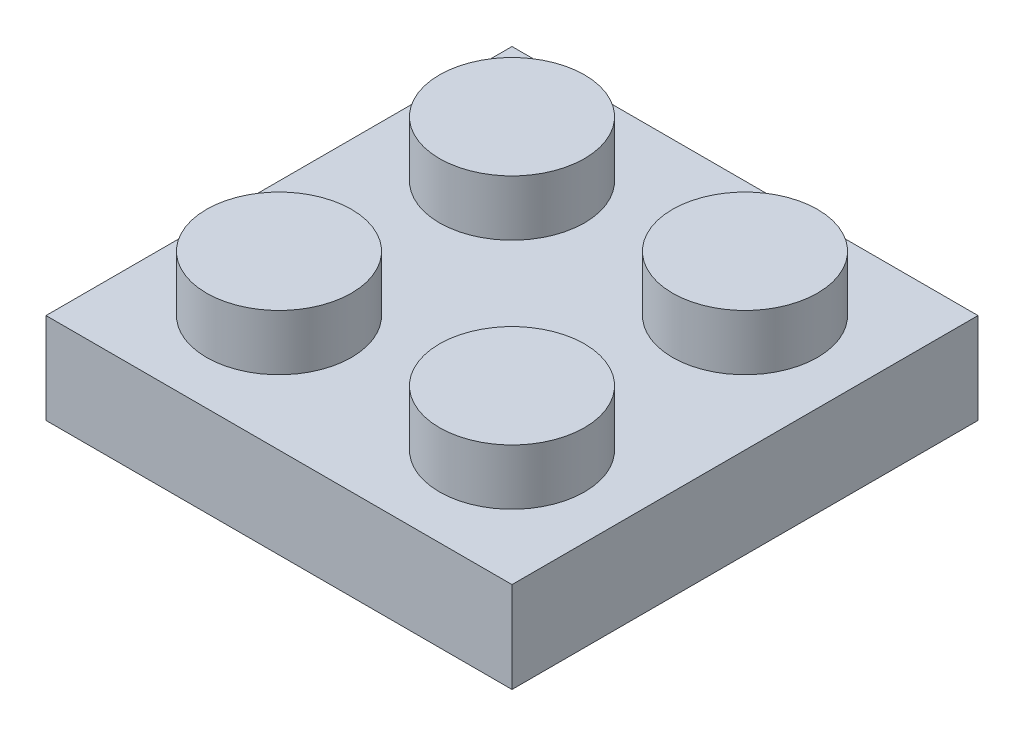
ISO-10303-21;
HEADER;
FILE_DESCRIPTION(('STEP AP214'),'2;1');
FILE_NAME('part.step','',(''),(''),'','','');
FILE_SCHEMA(('AUTOMOTIVE_DESIGN { 1 0 10303 214 1 1 1 1 }'));
ENDSEC;
DATA;
#1=APPLICATION_CONTEXT('core data for automotive mechanical design processes');
#2=APPLICATION_PROTOCOL_DEFINITION('international standard','automotive_design',2000,#1);
#3=PRODUCT_CONTEXT('',#1,'mechanical');
#4=PRODUCT('Part','Part','',(#3));
#5=PRODUCT_RELATED_PRODUCT_CATEGORY('part','',(#4));
#6=PRODUCT_DEFINITION_FORMATION('','',#4);
#7=PRODUCT_DEFINITION_CONTEXT('part definition',#1,'design');
#8=PRODUCT_DEFINITION('design','',#6,#7);
#9=PRODUCT_DEFINITION_SHAPE('','',#8);
#10=(LENGTH_UNIT() NAMED_UNIT(*) SI_UNIT(.MILLI.,.METRE.));
#11=(NAMED_UNIT(*) PLANE_ANGLE_UNIT() SI_UNIT($,.RADIAN.));
#12=(NAMED_UNIT(*) SI_UNIT($,.STERADIAN.) SOLID_ANGLE_UNIT());
#13=UNCERTAINTY_MEASURE_WITH_UNIT(LENGTH_MEASURE(1.E-05),#10,'distance_accuracy_value','');
#14=(GEOMETRIC_REPRESENTATION_CONTEXT(3) GLOBAL_UNCERTAINTY_ASSIGNED_CONTEXT((#13)) GLOBAL_UNIT_ASSIGNED_CONTEXT((#10,
#11,#12)) REPRESENTATION_CONTEXT('',''));
#15=CARTESIAN_POINT('',(0.,0.,0.));
#16=DIRECTION('',(0.,0.,1.));
#17=DIRECTION('',(1.,0.,0.));
#18=AXIS2_PLACEMENT_3D('',#15,#16,#17);
#19=CARTESIAN_POINT('',(-43.7441666397823,3.1,33.8664515920896));
#20=DIRECTION('',(0.,1.,0.));
#21=DIRECTION('',(0.,0.,1.));
#22=AXIS2_PLACEMENT_3D('',#19,#20,#21);
#23=PLANE('',#22);
#24=CARTESIAN_POINT('',(-39.7691666397823,3.1,45.7914515920896));
#25=DIRECTION('',(0.,1.,0.));
#26=DIRECTION('',(0.,0.,1.));
#27=AXIS2_PLACEMENT_3D('',#24,#25,#26);
#28=CIRCLE('',#27,2.475);
#29=CARTESIAN_POINT('',(-39.7691666397823,3.1,43.3164515920896));
#30=VERTEX_POINT('',#29);
#31=EDGE_CURVE('E247',#30,#30,#28,.T.);
#32=ORIENTED_EDGE('',*,*,#31,.F.);
#33=EDGE_LOOP('',(#32));
#34=FACE_BOUND('',#33,.T.);
#35=CARTESIAN_POINT('',(-39.7691666397823,3.1,37.8414515920896));
#36=DIRECTION('',(0.,1.,0.));
#37=DIRECTION('',(0.,0.,1.));
#38=AXIS2_PLACEMENT_3D('',#35,#36,#37);
#39=CIRCLE('',#38,2.475);
#40=CARTESIAN_POINT('',(-39.7691666397823,3.1,35.3664515920896));
#41=VERTEX_POINT('',#40);
#42=EDGE_CURVE('E132',#41,#41,#39,.T.);
#43=ORIENTED_EDGE('',*,*,#42,.F.);
#44=EDGE_LOOP('',(#43));
#45=FACE_BOUND('',#44,.T.);
#46=DIRECTION('',(-1.,0.,0.));
#47=VECTOR('',#46,1.);
#48=CARTESIAN_POINT('',(-27.8441666397823,3.1,33.8664515920896));
#49=LINE('',#48,#47);
#50=CARTESIAN_POINT('',(-27.8441666397823,3.1,33.8664515920896));
#51=VERTEX_POINT('',#50);
#52=CARTESIAN_POINT('',(-43.7441666397823,3.1,33.8664515920896));
#53=VERTEX_POINT('',#52);
#54=EDGE_CURVE('E149',#51,#53,#49,.T.);
#55=ORIENTED_EDGE('',*,*,#54,.T.);
#56=DIRECTION('',(0.,0.,1.));
#57=VECTOR('',#56,1.);
#58=CARTESIAN_POINT('',(-43.7441666397823,3.1,33.8664515920896));
#59=LINE('',#58,#57);
#60=CARTESIAN_POINT('',(-43.7441666397823,3.1,49.7664515920896));
#61=VERTEX_POINT('',#60);
#62=EDGE_CURVE('E84',#53,#61,#59,.T.);
#63=ORIENTED_EDGE('',*,*,#62,.T.);
#64=DIRECTION('',(1.,0.,0.));
#65=VECTOR('',#64,1.);
#66=CARTESIAN_POINT('',(-43.7441666397823,3.1,49.7664515920896));
#67=LINE('',#66,#65);
#68=CARTESIAN_POINT('',(-27.8441666397823,3.1,49.7664515920896));
#69=VERTEX_POINT('',#68);
#70=EDGE_CURVE('E152',#61,#69,#67,.T.);
#71=ORIENTED_EDGE('',*,*,#70,.T.);
#72=DIRECTION('',(0.,0.,-1.));
#73=VECTOR('',#72,1.);
#74=CARTESIAN_POINT('',(-27.8441666397823,3.1,49.7664515920896));
#75=LINE('',#74,#73);
#76=EDGE_CURVE('E56',#69,#51,#75,.T.);
#77=ORIENTED_EDGE('',*,*,#76,.T.);
#78=EDGE_LOOP('',(#55,#63,#71,#77));
#79=FACE_BOUND('',#78,.T.);
#80=CARTESIAN_POINT('',(-31.8191666397823,3.1,37.8414515920896));
#81=DIRECTION('',(0.,1.,0.));
#82=DIRECTION('',(0.,0.,1.));
#83=AXIS2_PLACEMENT_3D('',#80,#81,#82);
#84=CIRCLE('',#83,2.475);
#85=CARTESIAN_POINT('',(-31.8191666397823,3.1,35.3664515920896));
#86=VERTEX_POINT('',#85);
#87=EDGE_CURVE('E257',#86,#86,#84,.T.);
#88=ORIENTED_EDGE('',*,*,#87,.F.);
#89=EDGE_LOOP('',(#88));
#90=FACE_BOUND('',#89,.T.);
#91=CARTESIAN_POINT('',(-31.8191666397823,3.1,45.7914515920896));
#92=DIRECTION('',(0.,1.,0.));
#93=DIRECTION('',(0.,0.,1.));
#94=AXIS2_PLACEMENT_3D('',#91,#92,#93);
#95=CIRCLE('',#94,2.475);
#96=CARTESIAN_POINT('',(-31.8191666397823,3.1,43.3164515920896));
#97=VERTEX_POINT('',#96);
#98=EDGE_CURVE('E248',#97,#97,#95,.T.);
#99=ORIENTED_EDGE('',*,*,#98,.F.);
#100=EDGE_LOOP('',(#99));
#101=FACE_BOUND('',#100,.T.);
#102=ADVANCED_FACE('F32',(#34,#45,#79,#90,#101),#23,.T.);
#103=CARTESIAN_POINT('',(-27.8441666397823,3.1,33.8664515920896));
#104=DIRECTION('',(0.,0.,1.));
#105=DIRECTION('',(1.,0.,0.));
#106=AXIS2_PLACEMENT_3D('',#103,#104,#105);
#107=PLANE('',#106);
#108=DIRECTION('',(-1.,0.,0.));
#109=VECTOR('',#108,1.);
#110=CARTESIAN_POINT('',(-27.8441666397823,0.,33.8664515920896));
#111=LINE('',#110,#109);
#112=CARTESIAN_POINT('',(-27.8441666397823,0.,33.8664515920896));
#113=VERTEX_POINT('',#112);
#114=CARTESIAN_POINT('',(-43.7441666397823,0.,33.8664515920896));
#115=VERTEX_POINT('',#114);
#116=EDGE_CURVE('E145',#113,#115,#111,.T.);
#117=ORIENTED_EDGE('',*,*,#116,.T.);
#118=DIRECTION('',(0.,-1.,0.));
#119=VECTOR('',#118,1.);
#120=CARTESIAN_POINT('',(-43.7441666397823,3.1,33.8664515920896));
#121=LINE('',#120,#119);
#122=EDGE_CURVE('E11',#53,#115,#121,.T.);
#123=ORIENTED_EDGE('',*,*,#122,.F.);
#124=ORIENTED_EDGE('',*,*,#54,.F.);
#125=DIRECTION('',(0.,-1.,0.));
#126=VECTOR('',#125,1.);
#127=CARTESIAN_POINT('',(-27.8441666397823,3.1,33.8664515920896));
#128=LINE('',#127,#126);
#129=EDGE_CURVE('E155',#51,#113,#128,.T.);
#130=ORIENTED_EDGE('',*,*,#129,.T.);
#131=EDGE_LOOP('',(#117,#123,#124,#130));
#132=FACE_BOUND('',#131,.T.);
#133=ADVANCED_FACE('F34',(#132),#107,.F.);
#134=CARTESIAN_POINT('',(-43.7441666397823,3.1,33.8664515920896));
#135=DIRECTION('',(1.,0.,0.));
#136=DIRECTION('',(0.,0.,-1.));
#137=AXIS2_PLACEMENT_3D('',#134,#135,#136);
#138=PLANE('',#137);
#139=DIRECTION('',(0.,0.,1.));
#140=VECTOR('',#139,1.);
#141=CARTESIAN_POINT('',(-43.7441666397823,0.,33.8664515920896));
#142=LINE('',#141,#140);
#143=CARTESIAN_POINT('',(-43.7441666397823,0.,49.7664515920896));
#144=VERTEX_POINT('',#143);
#145=EDGE_CURVE('E158',#115,#144,#142,.T.);
#146=ORIENTED_EDGE('',*,*,#145,.T.);
#147=DIRECTION('',(0.,-1.,0.));
#148=VECTOR('',#147,1.);
#149=CARTESIAN_POINT('',(-43.7441666397823,3.1,49.7664515920896));
#150=LINE('',#149,#148);
#151=EDGE_CURVE('E40',#61,#144,#150,.T.);
#152=ORIENTED_EDGE('',*,*,#151,.F.);
#153=ORIENTED_EDGE('',*,*,#62,.F.);
#154=ORIENTED_EDGE('',*,*,#122,.T.);
#155=EDGE_LOOP('',(#146,#152,#153,#154));
#156=FACE_BOUND('',#155,.T.);
#157=ADVANCED_FACE('F186',(#156),#138,.F.);
#158=CARTESIAN_POINT('',(-43.7441666397823,3.1,49.7664515920896));
#159=DIRECTION('',(0.,0.,-1.));
#160=DIRECTION('',(-1.,0.,0.));
#161=AXIS2_PLACEMENT_3D('',#158,#159,#160);
#162=PLANE('',#161);
#163=DIRECTION('',(1.,0.,0.));
#164=VECTOR('',#163,1.);
#165=CARTESIAN_POINT('',(-43.7441666397823,0.,49.7664515920896));
#166=LINE('',#165,#164);
#167=CARTESIAN_POINT('',(-27.8441666397823,0.,49.7664515920896));
#168=VERTEX_POINT('',#167);
#169=EDGE_CURVE('E160',#144,#168,#166,.T.);
#170=ORIENTED_EDGE('',*,*,#169,.T.);
#171=DIRECTION('',(0.,-1.,0.));
#172=VECTOR('',#171,1.);
#173=CARTESIAN_POINT('',(-27.8441666397823,3.1,49.7664515920896));
#174=LINE('',#173,#172);
#175=EDGE_CURVE('E164',#69,#168,#174,.T.);
#176=ORIENTED_EDGE('',*,*,#175,.F.);
#177=ORIENTED_EDGE('',*,*,#70,.F.);
#178=ORIENTED_EDGE('',*,*,#151,.T.);
#179=EDGE_LOOP('',(#170,#176,#177,#178));
#180=FACE_BOUND('',#179,.T.);
#181=ADVANCED_FACE('F169',(#180),#162,.F.);
#182=CARTESIAN_POINT('',(-27.8441666397823,3.1,49.7664515920896));
#183=DIRECTION('',(-1.,0.,0.));
#184=DIRECTION('',(0.,0.,1.));
#185=AXIS2_PLACEMENT_3D('',#182,#183,#184);
#186=PLANE('',#185);
#187=DIRECTION('',(0.,0.,-1.));
#188=VECTOR('',#187,1.);
#189=CARTESIAN_POINT('',(-27.8441666397823,0.,49.7664515920896));
#190=LINE('',#189,#188);
#191=EDGE_CURVE('E77',#168,#113,#190,.T.);
#192=ORIENTED_EDGE('',*,*,#191,.T.);
#193=ORIENTED_EDGE('',*,*,#129,.F.);
#194=ORIENTED_EDGE('',*,*,#76,.F.);
#195=ORIENTED_EDGE('',*,*,#175,.T.);
#196=EDGE_LOOP('',(#192,#193,#194,#195));
#197=FACE_BOUND('',#196,.T.);
#198=ADVANCED_FACE('F177',(#197),#186,.F.);
#199=CARTESIAN_POINT('',(-43.7441666397823,0.,33.8664515920896));
#200=DIRECTION('',(0.,1.,0.));
#201=DIRECTION('',(0.,0.,1.));
#202=AXIS2_PLACEMENT_3D('',#199,#200,#201);
#203=PLANE('',#202);
#204=DIRECTION('',(1.,0.,0.));
#205=VECTOR('',#204,1.);
#206=CARTESIAN_POINT('',(-29.3441666397823,0.,35.3664515920896));
#207=LINE('',#206,#205);
#208=CARTESIAN_POINT('',(-42.2441666397823,0.,35.3664515920896));
#209=VERTEX_POINT('',#208);
#210=CARTESIAN_POINT('',(-29.3441666397823,0.,35.3664515920896));
#211=VERTEX_POINT('',#210);
#212=EDGE_CURVE('E138',#209,#211,#207,.T.);
#213=ORIENTED_EDGE('',*,*,#212,.F.);
#214=DIRECTION('',(0.,0.,-1.));
#215=VECTOR('',#214,1.);
#216=CARTESIAN_POINT('',(-42.2441666397823,0.,35.3664515920896));
#217=LINE('',#216,#215);
#218=CARTESIAN_POINT('',(-42.2441666397823,0.,48.2664515920896));
#219=VERTEX_POINT('',#218);
#220=EDGE_CURVE('E47',#219,#209,#217,.T.);
#221=ORIENTED_EDGE('',*,*,#220,.F.);
#222=DIRECTION('',(-1.,0.,0.));
#223=VECTOR('',#222,1.);
#224=CARTESIAN_POINT('',(-42.2441666397823,0.,48.2664515920896));
#225=LINE('',#224,#223);
#226=CARTESIAN_POINT('',(-29.3441666397823,0.,48.2664515920896));
#227=VERTEX_POINT('',#226);
#228=EDGE_CURVE('E126',#227,#219,#225,.T.);
#229=ORIENTED_EDGE('',*,*,#228,.F.);
#230=DIRECTION('',(0.,0.,1.));
#231=VECTOR('',#230,1.);
#232=CARTESIAN_POINT('',(-29.3441666397823,0.,48.2664515920896));
#233=LINE('',#232,#231);
#234=EDGE_CURVE('E129',#211,#227,#233,.T.);
#235=ORIENTED_EDGE('',*,*,#234,.F.);
#236=EDGE_LOOP('',(#213,#221,#229,#235));
#237=FACE_BOUND('',#236,.T.);
#238=ORIENTED_EDGE('',*,*,#116,.F.);
#239=ORIENTED_EDGE('',*,*,#191,.F.);
#240=ORIENTED_EDGE('',*,*,#169,.F.);
#241=ORIENTED_EDGE('',*,*,#145,.F.);
#242=EDGE_LOOP('',(#238,#239,#240,#241));
#243=FACE_BOUND('',#242,.T.);
#244=ADVANCED_FACE('F173',(#237,#243),#203,.F.);
#245=CARTESIAN_POINT('',(-42.2441666397823,1.9,35.3664515920896));
#246=DIRECTION('',(-1.,0.,0.));
#247=DIRECTION('',(0.,0.,1.));
#248=AXIS2_PLACEMENT_3D('',#245,#246,#247);
#249=PLANE('',#248);
#250=ORIENTED_EDGE('',*,*,#220,.T.);
#251=DIRECTION('',(0.,-1.,0.));
#252=VECTOR('',#251,1.);
#253=CARTESIAN_POINT('',(-42.2441666397823,1.9,35.3664515920896));
#254=LINE('',#253,#252);
#255=CARTESIAN_POINT('',(-42.2441666397823,1.9,35.3664515920896));
#256=VERTEX_POINT('',#255);
#257=EDGE_CURVE('E104',#256,#209,#254,.T.);
#258=ORIENTED_EDGE('',*,*,#257,.F.);
#259=DIRECTION('',(0.,0.,-1.));
#260=VECTOR('',#259,1.);
#261=CARTESIAN_POINT('',(-42.2441666397823,1.9,35.3664515920896));
#262=LINE('',#261,#260);
#263=CARTESIAN_POINT('',(-42.2441666397823,1.9,48.2664515920896));
#264=VERTEX_POINT('',#263);
#265=EDGE_CURVE('E108',#264,#256,#262,.T.);
#266=ORIENTED_EDGE('',*,*,#265,.F.);
#267=DIRECTION('',(0.,-1.,0.));
#268=VECTOR('',#267,1.);
#269=CARTESIAN_POINT('',(-42.2441666397823,1.9,48.2664515920896));
#270=LINE('',#269,#268);
#271=EDGE_CURVE('E143',#264,#219,#270,.T.);
#272=ORIENTED_EDGE('',*,*,#271,.T.);
#273=EDGE_LOOP('',(#250,#258,#266,#272));
#274=FACE_BOUND('',#273,.T.);
#275=ADVANCED_FACE('F106',(#274),#249,.F.);
#276=CARTESIAN_POINT('',(-42.2441666397823,1.9,48.2664515920896));
#277=DIRECTION('',(0.,0.,1.));
#278=DIRECTION('',(1.,0.,0.));
#279=AXIS2_PLACEMENT_3D('',#276,#277,#278);
#280=PLANE('',#279);
#281=ORIENTED_EDGE('',*,*,#228,.T.);
#282=ORIENTED_EDGE('',*,*,#271,.F.);
#283=DIRECTION('',(-1.,0.,0.));
#284=VECTOR('',#283,1.);
#285=CARTESIAN_POINT('',(-42.2441666397823,1.9,48.2664515920896));
#286=LINE('',#285,#284);
#287=CARTESIAN_POINT('',(-29.3441666397823,1.9,48.2664515920896));
#288=VERTEX_POINT('',#287);
#289=EDGE_CURVE('E114',#288,#264,#286,.T.);
#290=ORIENTED_EDGE('',*,*,#289,.F.);
#291=DIRECTION('',(0.,-1.,0.));
#292=VECTOR('',#291,1.);
#293=CARTESIAN_POINT('',(-29.3441666397823,1.9,48.2664515920896));
#294=LINE('',#293,#292);
#295=EDGE_CURVE('E146',#288,#227,#294,.T.);
#296=ORIENTED_EDGE('',*,*,#295,.T.);
#297=EDGE_LOOP('',(#281,#282,#290,#296));
#298=FACE_BOUND('',#297,.T.);
#299=ADVANCED_FACE('F199',(#298),#280,.F.);
#300=CARTESIAN_POINT('',(-29.3441666397823,1.9,48.2664515920896));
#301=DIRECTION('',(1.,0.,0.));
#302=DIRECTION('',(0.,0.,-1.));
#303=AXIS2_PLACEMENT_3D('',#300,#301,#302);
#304=PLANE('',#303);
#305=ORIENTED_EDGE('',*,*,#234,.T.);
#306=ORIENTED_EDGE('',*,*,#295,.F.);
#307=DIRECTION('',(0.,0.,1.));
#308=VECTOR('',#307,1.);
#309=CARTESIAN_POINT('',(-29.3441666397823,1.9,48.2664515920896));
#310=LINE('',#309,#308);
#311=CARTESIAN_POINT('',(-29.3441666397823,1.9,35.3664515920896));
#312=VERTEX_POINT('',#311);
#313=EDGE_CURVE('E122',#312,#288,#310,.T.);
#314=ORIENTED_EDGE('',*,*,#313,.F.);
#315=DIRECTION('',(0.,-1.,0.));
#316=VECTOR('',#315,1.);
#317=CARTESIAN_POINT('',(-29.3441666397823,1.9,35.3664515920896));
#318=LINE('',#317,#316);
#319=EDGE_CURVE('E113',#312,#211,#318,.T.);
#320=ORIENTED_EDGE('',*,*,#319,.T.);
#321=EDGE_LOOP('',(#305,#306,#314,#320));
#322=FACE_BOUND('',#321,.T.);
#323=ADVANCED_FACE('F202',(#322),#304,.F.);
#324=CARTESIAN_POINT('',(-29.3441666397823,1.9,35.3664515920896));
#325=DIRECTION('',(0.,0.,-1.));
#326=DIRECTION('',(-1.,0.,0.));
#327=AXIS2_PLACEMENT_3D('',#324,#325,#326);
#328=PLANE('',#327);
#329=ORIENTED_EDGE('',*,*,#212,.T.);
#330=ORIENTED_EDGE('',*,*,#319,.F.);
#331=DIRECTION('',(1.,0.,0.));
#332=VECTOR('',#331,1.);
#333=CARTESIAN_POINT('',(-29.3441666397823,1.9,35.3664515920896));
#334=LINE('',#333,#332);
#335=EDGE_CURVE('E117',#256,#312,#334,.T.);
#336=ORIENTED_EDGE('',*,*,#335,.F.);
#337=ORIENTED_EDGE('',*,*,#257,.T.);
#338=EDGE_LOOP('',(#329,#330,#336,#337));
#339=FACE_BOUND('',#338,.T.);
#340=ADVANCED_FACE('F118',(#339),#328,.F.);
#341=CARTESIAN_POINT('',(-42.2441666397823,1.9,48.2664515920896));
#342=DIRECTION('',(0.,1.,0.));
#343=DIRECTION('',(0.,0.,1.));
#344=AXIS2_PLACEMENT_3D('',#341,#342,#343);
#345=PLANE('',#344);
#346=ORIENTED_EDGE('',*,*,#265,.T.);
#347=ORIENTED_EDGE('',*,*,#335,.T.);
#348=ORIENTED_EDGE('',*,*,#313,.T.);
#349=ORIENTED_EDGE('',*,*,#289,.T.);
#350=EDGE_LOOP('',(#346,#347,#348,#349));
#351=FACE_BOUND('',#350,.T.);
#352=ADVANCED_FACE('F124',(#351),#345,.F.);
#353=CARTESIAN_POINT('',(-39.7691666397823,5.,37.8414515920896));
#354=DIRECTION('',(0.,-1.,0.));
#355=DIRECTION('',(0.,0.,-1.));
#356=AXIS2_PLACEMENT_3D('',#353,#354,#355);
#357=CYLINDRICAL_SURFACE('',#356,2.475);
#358=CARTESIAN_POINT('',(-39.7691666397823,5.,37.8414515920896));
#359=DIRECTION('',(0.,1.,0.));
#360=DIRECTION('',(0.,0.,1.));
#361=AXIS2_PLACEMENT_3D('',#358,#359,#360);
#362=CIRCLE('',#361,2.475);
#363=CARTESIAN_POINT('',(-39.7691666397823,5.,35.3664515920896));
#364=VERTEX_POINT('',#363);
#365=EDGE_CURVE('E139',#364,#364,#362,.T.);
#366=CARTESIAN_POINT('',(-39.7691666397823,5.,35.3664515920896));
#367=CARTESIAN_POINT('',(-39.7691666397823,4.98020833333333,35.3664515920896));
#368=CARTESIAN_POINT('',(-39.7691666397823,4.96041666666667,35.3664515920896));
#369=CARTESIAN_POINT('',(-39.7691666397823,4.92083333333333,35.3664515920896));
#370=CARTESIAN_POINT('',(-39.7691666397823,4.90104166666667,35.3664515920896));
#371=CARTESIAN_POINT('',(-39.7691666397823,4.86145833333333,35.3664515920896));
#372=CARTESIAN_POINT('',(-39.7691666397823,4.84166666666667,35.3664515920896));
#373=CARTESIAN_POINT('',(-39.7691666397823,4.80208333333333,35.3664515920896));
#374=CARTESIAN_POINT('',(-39.7691666397823,4.78229166666667,35.3664515920896));
#375=CARTESIAN_POINT('',(-39.7691666397823,4.74270833333333,35.3664515920896));
#376=CARTESIAN_POINT('',(-39.7691666397823,4.72291666666667,35.3664515920896));
#377=CARTESIAN_POINT('',(-39.7691666397823,4.68333333333333,35.3664515920896));
#378=CARTESIAN_POINT('',(-39.7691666397823,4.66354166666667,35.3664515920896));
#379=CARTESIAN_POINT('',(-39.7691666397823,4.62395833333333,35.3664515920896));
#380=CARTESIAN_POINT('',(-39.7691666397823,4.60416666666667,35.3664515920896));
#381=CARTESIAN_POINT('',(-39.7691666397823,4.56458333333333,35.3664515920896));
#382=CARTESIAN_POINT('',(-39.7691666397823,4.54479166666667,35.3664515920896));
#383=CARTESIAN_POINT('',(-39.7691666397823,4.50520833333333,35.3664515920896));
#384=CARTESIAN_POINT('',(-39.7691666397823,4.48541666666667,35.3664515920896));
#385=CARTESIAN_POINT('',(-39.7691666397823,4.44583333333333,35.3664515920896));
#386=CARTESIAN_POINT('',(-39.7691666397823,4.42604166666667,35.3664515920896));
#387=CARTESIAN_POINT('',(-39.7691666397823,4.38645833333333,35.3664515920896));
#388=CARTESIAN_POINT('',(-39.7691666397823,4.36666666666667,35.3664515920896));
#389=CARTESIAN_POINT('',(-39.7691666397823,4.32708333333333,35.3664515920896));
#390=CARTESIAN_POINT('',(-39.7691666397823,4.30729166666667,35.3664515920896));
#391=CARTESIAN_POINT('',(-39.7691666397823,4.26770833333333,35.3664515920896));
#392=CARTESIAN_POINT('',(-39.7691666397823,4.24791666666667,35.3664515920896));
#393=CARTESIAN_POINT('',(-39.7691666397823,4.20833333333333,35.3664515920896));
#394=CARTESIAN_POINT('',(-39.7691666397823,4.18854166666667,35.3664515920896));
#395=CARTESIAN_POINT('',(-39.7691666397823,4.14895833333333,35.3664515920896));
#396=CARTESIAN_POINT('',(-39.7691666397823,4.12916666666667,35.3664515920896));
#397=CARTESIAN_POINT('',(-39.7691666397823,4.08958333333333,35.3664515920896));
#398=CARTESIAN_POINT('',(-39.7691666397823,4.06979166666667,35.3664515920896));
#399=CARTESIAN_POINT('',(-39.7691666397823,4.03020833333333,35.3664515920896));
#400=CARTESIAN_POINT('',(-39.7691666397823,4.01041666666667,35.3664515920896));
#401=CARTESIAN_POINT('',(-39.7691666397823,3.97083333333333,35.3664515920896));
#402=CARTESIAN_POINT('',(-39.7691666397823,3.95104166666667,35.3664515920896));
#403=CARTESIAN_POINT('',(-39.7691666397823,3.91145833333333,35.3664515920896));
#404=CARTESIAN_POINT('',(-39.7691666397823,3.89166666666667,35.3664515920896));
#405=CARTESIAN_POINT('',(-39.7691666397823,3.85208333333333,35.3664515920896));
#406=CARTESIAN_POINT('',(-39.7691666397823,3.83229166666667,35.3664515920896));
#407=CARTESIAN_POINT('',(-39.7691666397823,3.79270833333333,35.3664515920896));
#408=CARTESIAN_POINT('',(-39.7691666397823,3.77291666666667,35.3664515920896));
#409=CARTESIAN_POINT('',(-39.7691666397823,3.73333333333333,35.3664515920896));
#410=CARTESIAN_POINT('',(-39.7691666397823,3.71354166666667,35.3664515920896));
#411=CARTESIAN_POINT('',(-39.7691666397823,3.67395833333333,35.3664515920896));
#412=CARTESIAN_POINT('',(-39.7691666397823,3.65416666666667,35.3664515920896));
#413=CARTESIAN_POINT('',(-39.7691666397823,3.61458333333333,35.3664515920896));
#414=CARTESIAN_POINT('',(-39.7691666397823,3.59479166666667,35.3664515920896));
#415=CARTESIAN_POINT('',(-39.7691666397823,3.55520833333333,35.3664515920896));
#416=CARTESIAN_POINT('',(-39.7691666397823,3.53541666666667,35.3664515920896));
#417=CARTESIAN_POINT('',(-39.7691666397823,3.49583333333333,35.3664515920896));
#418=CARTESIAN_POINT('',(-39.7691666397823,3.47604166666667,35.3664515920896));
#419=CARTESIAN_POINT('',(-39.7691666397823,3.43645833333333,35.3664515920896));
#420=CARTESIAN_POINT('',(-39.7691666397823,3.41666666666667,35.3664515920896));
#421=CARTESIAN_POINT('',(-39.7691666397823,3.37708333333333,35.3664515920896));
#422=CARTESIAN_POINT('',(-39.7691666397823,3.35729166666667,35.3664515920896));
#423=CARTESIAN_POINT('',(-39.7691666397823,3.31770833333333,35.3664515920896));
#424=CARTESIAN_POINT('',(-39.7691666397823,3.29791666666667,35.3664515920896));
#425=CARTESIAN_POINT('',(-39.7691666397823,3.25833333333333,35.3664515920896));
#426=CARTESIAN_POINT('',(-39.7691666397823,3.23854166666667,35.3664515920896));
#427=CARTESIAN_POINT('',(-39.7691666397823,3.19895833333333,35.3664515920896));
#428=CARTESIAN_POINT('',(-39.7691666397823,3.17916666666667,35.3664515920896));
#429=CARTESIAN_POINT('',(-39.7691666397823,3.13958333333333,35.3664515920896));
#430=CARTESIAN_POINT('',(-39.7691666397823,3.11979166666667,35.3664515920896));
#431=CARTESIAN_POINT('',(-39.7691666397823,3.1,35.3664515920896));
#432=B_SPLINE_CURVE_WITH_KNOTS('',3,(#366,#367,#368,#369,#370,#371,#372,#373,#374,#375,#376,
#377,#378,#379,#380,#381,#382,#383,#384,#385,#386,#387,#388,#389,#390,#391,#392,#393,#394,#395,
#396,#397,#398,#399,#400,#401,#402,#403,#404,#405,#406,#407,#408,#409,#410,#411,#412,#413,#414,
#415,#416,#417,#418,#419,#420,#421,#422,#423,#424,#425,#426,#427,#428,#429,#430,#431),
.UNSPECIFIED.,.F.,.F.,(4,2,2,2,2,2,2,2,2,2,2,2,2,2,2,2,2,2,2,2,2,2,2,2,2,2,2,2,2,2,2,2,4),(0.,
0.0593750000000004,0.118750000000001,0.178125,0.237500000000001,0.296875,0.356250000000001,
0.415625,0.475000000000001,0.534375,0.593750000000001,0.653125,0.7125,0.771875000000001,0.83125,
0.890625000000001,0.95,1.009375,1.06875,1.128125,1.1875,1.246875,1.30625,1.365625,1.425,
1.484375,1.54375,1.603125,1.6625,1.721875,1.78125,1.840625,1.9),.UNSPECIFIED.);
#433=EDGE_CURVE('BSEAM211',#364,#41,#432,.T.);
#434=ORIENTED_EDGE('',*,*,#365,.F.);
#435=ORIENTED_EDGE('',*,*,#42,.T.);
#436=ORIENTED_EDGE('',*,*,#433,.T.);
#437=ORIENTED_EDGE('',*,*,#433,.F.);
#438=EDGE_LOOP('',(#434,#436,#435,#437));
#439=FACE_BOUND('',#438,.T.);
#440=ADVANCED_FACE('F211',(#439),#357,.T.);
#441=CARTESIAN_POINT('',(-39.7691666397823,5.,37.8414515920896));
#442=DIRECTION('',(0.,1.,0.));
#443=DIRECTION('',(0.,0.,1.));
#444=AXIS2_PLACEMENT_3D('',#441,#442,#443);
#445=PLANE('',#444);
#446=ORIENTED_EDGE('',*,*,#365,.T.);
#447=EDGE_LOOP('',(#446));
#448=FACE_BOUND('',#447,.T.);
#449=ADVANCED_FACE('F214',(#448),#445,.T.);
#450=CARTESIAN_POINT('',(-31.8191666397823,5.,37.8414515920896));
#451=DIRECTION('',(0.,-1.,0.));
#452=DIRECTION('',(0.,0.,-1.));
#453=AXIS2_PLACEMENT_3D('',#450,#451,#452);
#454=CYLINDRICAL_SURFACE('',#453,2.475);
#455=CARTESIAN_POINT('',(-31.8191666397823,5.,37.8414515920896));
#456=DIRECTION('',(0.,1.,0.));
#457=DIRECTION('',(0.,0.,1.));
#458=AXIS2_PLACEMENT_3D('',#455,#456,#457);
#459=CIRCLE('',#458,2.475);
#460=CARTESIAN_POINT('',(-31.8191666397823,5.,35.3664515920896));
#461=VERTEX_POINT('',#460);
#462=EDGE_CURVE('E259',#461,#461,#459,.T.);
#463=CARTESIAN_POINT('',(-31.8191666397823,5.,35.3664515920896));
#464=CARTESIAN_POINT('',(-31.8191666397823,4.98020833333333,35.3664515920896));
#465=CARTESIAN_POINT('',(-31.8191666397823,4.96041666666667,35.3664515920896));
#466=CARTESIAN_POINT('',(-31.8191666397823,4.92083333333333,35.3664515920896));
#467=CARTESIAN_POINT('',(-31.8191666397823,4.90104166666667,35.3664515920896));
#468=CARTESIAN_POINT('',(-31.8191666397823,4.86145833333333,35.3664515920896));
#469=CARTESIAN_POINT('',(-31.8191666397823,4.84166666666667,35.3664515920896));
#470=CARTESIAN_POINT('',(-31.8191666397823,4.80208333333333,35.3664515920896));
#471=CARTESIAN_POINT('',(-31.8191666397823,4.78229166666667,35.3664515920896));
#472=CARTESIAN_POINT('',(-31.8191666397823,4.74270833333333,35.3664515920896));
#473=CARTESIAN_POINT('',(-31.8191666397823,4.72291666666667,35.3664515920896));
#474=CARTESIAN_POINT('',(-31.8191666397823,4.68333333333333,35.3664515920896));
#475=CARTESIAN_POINT('',(-31.8191666397823,4.66354166666667,35.3664515920896));
#476=CARTESIAN_POINT('',(-31.8191666397823,4.62395833333333,35.3664515920896));
#477=CARTESIAN_POINT('',(-31.8191666397823,4.60416666666667,35.3664515920896));
#478=CARTESIAN_POINT('',(-31.8191666397823,4.56458333333333,35.3664515920896));
#479=CARTESIAN_POINT('',(-31.8191666397823,4.54479166666667,35.3664515920896));
#480=CARTESIAN_POINT('',(-31.8191666397823,4.50520833333333,35.3664515920896));
#481=CARTESIAN_POINT('',(-31.8191666397823,4.48541666666667,35.3664515920896));
#482=CARTESIAN_POINT('',(-31.8191666397823,4.44583333333333,35.3664515920896));
#483=CARTESIAN_POINT('',(-31.8191666397823,4.42604166666667,35.3664515920896));
#484=CARTESIAN_POINT('',(-31.8191666397823,4.38645833333333,35.3664515920896));
#485=CARTESIAN_POINT('',(-31.8191666397823,4.36666666666667,35.3664515920896));
#486=CARTESIAN_POINT('',(-31.8191666397823,4.32708333333333,35.3664515920896));
#487=CARTESIAN_POINT('',(-31.8191666397823,4.30729166666667,35.3664515920896));
#488=CARTESIAN_POINT('',(-31.8191666397823,4.26770833333333,35.3664515920896));
#489=CARTESIAN_POINT('',(-31.8191666397823,4.24791666666667,35.3664515920896));
#490=CARTESIAN_POINT('',(-31.8191666397823,4.20833333333333,35.3664515920896));
#491=CARTESIAN_POINT('',(-31.8191666397823,4.18854166666667,35.3664515920896));
#492=CARTESIAN_POINT('',(-31.8191666397823,4.14895833333333,35.3664515920896));
#493=CARTESIAN_POINT('',(-31.8191666397823,4.12916666666667,35.3664515920896));
#494=CARTESIAN_POINT('',(-31.8191666397823,4.08958333333333,35.3664515920896));
#495=CARTESIAN_POINT('',(-31.8191666397823,4.06979166666667,35.3664515920896));
#496=CARTESIAN_POINT('',(-31.8191666397823,4.03020833333333,35.3664515920896));
#497=CARTESIAN_POINT('',(-31.8191666397823,4.01041666666667,35.3664515920896));
#498=CARTESIAN_POINT('',(-31.8191666397823,3.97083333333333,35.3664515920896));
#499=CARTESIAN_POINT('',(-31.8191666397823,3.95104166666667,35.3664515920896));
#500=CARTESIAN_POINT('',(-31.8191666397823,3.91145833333333,35.3664515920896));
#501=CARTESIAN_POINT('',(-31.8191666397823,3.89166666666667,35.3664515920896));
#502=CARTESIAN_POINT('',(-31.8191666397823,3.85208333333333,35.3664515920896));
#503=CARTESIAN_POINT('',(-31.8191666397823,3.83229166666667,35.3664515920896));
#504=CARTESIAN_POINT('',(-31.8191666397823,3.79270833333333,35.3664515920896));
#505=CARTESIAN_POINT('',(-31.8191666397823,3.77291666666667,35.3664515920896));
#506=CARTESIAN_POINT('',(-31.8191666397823,3.73333333333333,35.3664515920896));
#507=CARTESIAN_POINT('',(-31.8191666397823,3.71354166666667,35.3664515920896));
#508=CARTESIAN_POINT('',(-31.8191666397823,3.67395833333333,35.3664515920896));
#509=CARTESIAN_POINT('',(-31.8191666397823,3.65416666666667,35.3664515920896));
#510=CARTESIAN_POINT('',(-31.8191666397823,3.61458333333333,35.3664515920896));
#511=CARTESIAN_POINT('',(-31.8191666397823,3.59479166666667,35.3664515920896));
#512=CARTESIAN_POINT('',(-31.8191666397823,3.55520833333333,35.3664515920896));
#513=CARTESIAN_POINT('',(-31.8191666397823,3.53541666666667,35.3664515920896));
#514=CARTESIAN_POINT('',(-31.8191666397823,3.49583333333333,35.3664515920896));
#515=CARTESIAN_POINT('',(-31.8191666397823,3.47604166666667,35.3664515920896));
#516=CARTESIAN_POINT('',(-31.8191666397823,3.43645833333333,35.3664515920896));
#517=CARTESIAN_POINT('',(-31.8191666397823,3.41666666666667,35.3664515920896));
#518=CARTESIAN_POINT('',(-31.8191666397823,3.37708333333333,35.3664515920896));
#519=CARTESIAN_POINT('',(-31.8191666397823,3.35729166666667,35.3664515920896));
#520=CARTESIAN_POINT('',(-31.8191666397823,3.31770833333333,35.3664515920896));
#521=CARTESIAN_POINT('',(-31.8191666397823,3.29791666666667,35.3664515920896));
#522=CARTESIAN_POINT('',(-31.8191666397823,3.25833333333333,35.3664515920896));
#523=CARTESIAN_POINT('',(-31.8191666397823,3.23854166666667,35.3664515920896));
#524=CARTESIAN_POINT('',(-31.8191666397823,3.19895833333333,35.3664515920896));
#525=CARTESIAN_POINT('',(-31.8191666397823,3.17916666666667,35.3664515920896));
#526=CARTESIAN_POINT('',(-31.8191666397823,3.13958333333333,35.3664515920896));
#527=CARTESIAN_POINT('',(-31.8191666397823,3.11979166666667,35.3664515920896));
#528=CARTESIAN_POINT('',(-31.8191666397823,3.1,35.3664515920896));
#529=B_SPLINE_CURVE_WITH_KNOTS('',3,(#463,#464,#465,#466,#467,#468,#469,#470,#471,#472,#473,
#474,#475,#476,#477,#478,#479,#480,#481,#482,#483,#484,#485,#486,#487,#488,#489,#490,#491,#492,
#493,#494,#495,#496,#497,#498,#499,#500,#501,#502,#503,#504,#505,#506,#507,#508,#509,#510,#511,
#512,#513,#514,#515,#516,#517,#518,#519,#520,#521,#522,#523,#524,#525,#526,#527,#528),
.UNSPECIFIED.,.F.,.F.,(4,2,2,2,2,2,2,2,2,2,2,2,2,2,2,2,2,2,2,2,2,2,2,2,2,2,2,2,2,2,2,2,4),(0.,
0.0593750000000004,0.118750000000001,0.178125,0.237500000000001,0.296875,0.356250000000001,
0.415625,0.475000000000001,0.534375,0.593750000000001,0.653125,0.7125,0.771875000000001,0.83125,
0.890625000000001,0.95,1.009375,1.06875,1.128125,1.1875,1.246875,1.30625,1.365625,1.425,
1.484375,1.54375,1.603125,1.6625,1.721875,1.78125,1.840625,1.9),.UNSPECIFIED.);
#530=EDGE_CURVE('BSEAM218',#461,#86,#529,.T.);
#531=ORIENTED_EDGE('',*,*,#462,.F.);
#532=ORIENTED_EDGE('',*,*,#87,.T.);
#533=ORIENTED_EDGE('',*,*,#530,.T.);
#534=ORIENTED_EDGE('',*,*,#530,.F.);
#535=EDGE_LOOP('',(#531,#533,#532,#534));
#536=FACE_BOUND('',#535,.T.);
#537=ADVANCED_FACE('F218',(#536),#454,.T.);
#538=CARTESIAN_POINT('',(-31.8191666397823,5.,37.8414515920896));
#539=DIRECTION('',(0.,1.,0.));
#540=DIRECTION('',(0.,0.,1.));
#541=AXIS2_PLACEMENT_3D('',#538,#539,#540);
#542=PLANE('',#541);
#543=ORIENTED_EDGE('',*,*,#462,.T.);
#544=EDGE_LOOP('',(#543));
#545=FACE_BOUND('',#544,.T.);
#546=ADVANCED_FACE('F222',(#545),#542,.T.);
#547=CARTESIAN_POINT('',(-39.7691666397823,5.,45.7914515920896));
#548=DIRECTION('',(0.,-1.,0.));
#549=DIRECTION('',(0.,0.,-1.));
#550=AXIS2_PLACEMENT_3D('',#547,#548,#549);
#551=CYLINDRICAL_SURFACE('',#550,2.475);
#552=CARTESIAN_POINT('',(-39.7691666397823,5.,45.7914515920896));
#553=DIRECTION('',(0.,1.,0.));
#554=DIRECTION('',(0.,0.,1.));
#555=AXIS2_PLACEMENT_3D('',#552,#553,#554);
#556=CIRCLE('',#555,2.475);
#557=CARTESIAN_POINT('',(-39.7691666397823,5.,43.3164515920896));
#558=VERTEX_POINT('',#557);
#559=EDGE_CURVE('E251',#558,#558,#556,.T.);
#560=CARTESIAN_POINT('',(-39.7691666397823,5.,43.3164515920896));
#561=CARTESIAN_POINT('',(-39.7691666397823,4.98020833333333,43.3164515920896));
#562=CARTESIAN_POINT('',(-39.7691666397823,4.96041666666667,43.3164515920896));
#563=CARTESIAN_POINT('',(-39.7691666397823,4.92083333333333,43.3164515920896));
#564=CARTESIAN_POINT('',(-39.7691666397823,4.90104166666667,43.3164515920896));
#565=CARTESIAN_POINT('',(-39.7691666397823,4.86145833333333,43.3164515920896));
#566=CARTESIAN_POINT('',(-39.7691666397823,4.84166666666667,43.3164515920896));
#567=CARTESIAN_POINT('',(-39.7691666397823,4.80208333333333,43.3164515920896));
#568=CARTESIAN_POINT('',(-39.7691666397823,4.78229166666667,43.3164515920896));
#569=CARTESIAN_POINT('',(-39.7691666397823,4.74270833333333,43.3164515920896));
#570=CARTESIAN_POINT('',(-39.7691666397823,4.72291666666667,43.3164515920896));
#571=CARTESIAN_POINT('',(-39.7691666397823,4.68333333333333,43.3164515920896));
#572=CARTESIAN_POINT('',(-39.7691666397823,4.66354166666667,43.3164515920896));
#573=CARTESIAN_POINT('',(-39.7691666397823,4.62395833333333,43.3164515920896));
#574=CARTESIAN_POINT('',(-39.7691666397823,4.60416666666667,43.3164515920896));
#575=CARTESIAN_POINT('',(-39.7691666397823,4.56458333333333,43.3164515920896));
#576=CARTESIAN_POINT('',(-39.7691666397823,4.54479166666667,43.3164515920896));
#577=CARTESIAN_POINT('',(-39.7691666397823,4.50520833333333,43.3164515920896));
#578=CARTESIAN_POINT('',(-39.7691666397823,4.48541666666667,43.3164515920896));
#579=CARTESIAN_POINT('',(-39.7691666397823,4.44583333333333,43.3164515920896));
#580=CARTESIAN_POINT('',(-39.7691666397823,4.42604166666667,43.3164515920896));
#581=CARTESIAN_POINT('',(-39.7691666397823,4.38645833333333,43.3164515920896));
#582=CARTESIAN_POINT('',(-39.7691666397823,4.36666666666667,43.3164515920896));
#583=CARTESIAN_POINT('',(-39.7691666397823,4.32708333333333,43.3164515920896));
#584=CARTESIAN_POINT('',(-39.7691666397823,4.30729166666667,43.3164515920896));
#585=CARTESIAN_POINT('',(-39.7691666397823,4.26770833333333,43.3164515920896));
#586=CARTESIAN_POINT('',(-39.7691666397823,4.24791666666667,43.3164515920896));
#587=CARTESIAN_POINT('',(-39.7691666397823,4.20833333333333,43.3164515920896));
#588=CARTESIAN_POINT('',(-39.7691666397823,4.18854166666667,43.3164515920896));
#589=CARTESIAN_POINT('',(-39.7691666397823,4.14895833333333,43.3164515920896));
#590=CARTESIAN_POINT('',(-39.7691666397823,4.12916666666667,43.3164515920896));
#591=CARTESIAN_POINT('',(-39.7691666397823,4.08958333333333,43.3164515920896));
#592=CARTESIAN_POINT('',(-39.7691666397823,4.06979166666667,43.3164515920896));
#593=CARTESIAN_POINT('',(-39.7691666397823,4.03020833333333,43.3164515920896));
#594=CARTESIAN_POINT('',(-39.7691666397823,4.01041666666667,43.3164515920896));
#595=CARTESIAN_POINT('',(-39.7691666397823,3.97083333333333,43.3164515920896));
#596=CARTESIAN_POINT('',(-39.7691666397823,3.95104166666667,43.3164515920896));
#597=CARTESIAN_POINT('',(-39.7691666397823,3.91145833333333,43.3164515920896));
#598=CARTESIAN_POINT('',(-39.7691666397823,3.89166666666667,43.3164515920896));
#599=CARTESIAN_POINT('',(-39.7691666397823,3.85208333333333,43.3164515920896));
#600=CARTESIAN_POINT('',(-39.7691666397823,3.83229166666667,43.3164515920896));
#601=CARTESIAN_POINT('',(-39.7691666397823,3.79270833333333,43.3164515920896));
#602=CARTESIAN_POINT('',(-39.7691666397823,3.77291666666667,43.3164515920896));
#603=CARTESIAN_POINT('',(-39.7691666397823,3.73333333333333,43.3164515920896));
#604=CARTESIAN_POINT('',(-39.7691666397823,3.71354166666667,43.3164515920896));
#605=CARTESIAN_POINT('',(-39.7691666397823,3.67395833333333,43.3164515920896));
#606=CARTESIAN_POINT('',(-39.7691666397823,3.65416666666667,43.3164515920896));
#607=CARTESIAN_POINT('',(-39.7691666397823,3.61458333333333,43.3164515920896));
#608=CARTESIAN_POINT('',(-39.7691666397823,3.59479166666667,43.3164515920896));
#609=CARTESIAN_POINT('',(-39.7691666397823,3.55520833333333,43.3164515920896));
#610=CARTESIAN_POINT('',(-39.7691666397823,3.53541666666667,43.3164515920896));
#611=CARTESIAN_POINT('',(-39.7691666397823,3.49583333333333,43.3164515920896));
#612=CARTESIAN_POINT('',(-39.7691666397823,3.47604166666667,43.3164515920896));
#613=CARTESIAN_POINT('',(-39.7691666397823,3.43645833333333,43.3164515920896));
#614=CARTESIAN_POINT('',(-39.7691666397823,3.41666666666667,43.3164515920896));
#615=CARTESIAN_POINT('',(-39.7691666397823,3.37708333333333,43.3164515920896));
#616=CARTESIAN_POINT('',(-39.7691666397823,3.35729166666667,43.3164515920896));
#617=CARTESIAN_POINT('',(-39.7691666397823,3.31770833333333,43.3164515920896));
#618=CARTESIAN_POINT('',(-39.7691666397823,3.29791666666667,43.3164515920896));
#619=CARTESIAN_POINT('',(-39.7691666397823,3.25833333333333,43.3164515920896));
#620=CARTESIAN_POINT('',(-39.7691666397823,3.23854166666667,43.3164515920896));
#621=CARTESIAN_POINT('',(-39.7691666397823,3.19895833333333,43.3164515920896));
#622=CARTESIAN_POINT('',(-39.7691666397823,3.17916666666667,43.3164515920896));
#623=CARTESIAN_POINT('',(-39.7691666397823,3.13958333333333,43.3164515920896));
#624=CARTESIAN_POINT('',(-39.7691666397823,3.11979166666667,43.3164515920896));
#625=CARTESIAN_POINT('',(-39.7691666397823,3.1,43.3164515920896));
#626=B_SPLINE_CURVE_WITH_KNOTS('',3,(#560,#561,#562,#563,#564,#565,#566,#567,#568,#569,#570,
#571,#572,#573,#574,#575,#576,#577,#578,#579,#580,#581,#582,#583,#584,#585,#586,#587,#588,#589,
#590,#591,#592,#593,#594,#595,#596,#597,#598,#599,#600,#601,#602,#603,#604,#605,#606,#607,#608,
#609,#610,#611,#612,#613,#614,#615,#616,#617,#618,#619,#620,#621,#622,#623,#624,#625),
.UNSPECIFIED.,.F.,.F.,(4,2,2,2,2,2,2,2,2,2,2,2,2,2,2,2,2,2,2,2,2,2,2,2,2,2,2,2,2,2,2,2,4),(0.,
0.0593750000000004,0.118750000000001,0.178125,0.237500000000001,0.296875,0.356250000000001,
0.415625,0.475000000000001,0.534375,0.593750000000001,0.653125,0.7125,0.771875000000001,0.83125,
0.890625000000001,0.95,1.009375,1.06875,1.128125,1.1875,1.246875,1.30625,1.365625,1.425,
1.484375,1.54375,1.603125,1.6625,1.721875,1.78125,1.840625,1.9),.UNSPECIFIED.);
#627=EDGE_CURVE('BSEAM226',#558,#30,#626,.T.);
#628=ORIENTED_EDGE('',*,*,#559,.F.);
#629=ORIENTED_EDGE('',*,*,#31,.T.);
#630=ORIENTED_EDGE('',*,*,#627,.T.);
#631=ORIENTED_EDGE('',*,*,#627,.F.);
#632=EDGE_LOOP('',(#628,#630,#629,#631));
#633=FACE_BOUND('',#632,.T.);
#634=ADVANCED_FACE('F226',(#633),#551,.T.);
#635=CARTESIAN_POINT('',(-39.7691666397823,5.,45.7914515920896));
#636=DIRECTION('',(0.,1.,0.));
#637=DIRECTION('',(0.,0.,1.));
#638=AXIS2_PLACEMENT_3D('',#635,#636,#637);
#639=PLANE('',#638);
#640=ORIENTED_EDGE('',*,*,#559,.T.);
#641=EDGE_LOOP('',(#640));
#642=FACE_BOUND('',#641,.T.);
#643=ADVANCED_FACE('F230',(#642),#639,.T.);
#644=CARTESIAN_POINT('',(-31.8191666397823,5.,45.7914515920896));
#645=DIRECTION('',(0.,-1.,0.));
#646=DIRECTION('',(0.,0.,-1.));
#647=AXIS2_PLACEMENT_3D('',#644,#645,#646);
#648=CYLINDRICAL_SURFACE('',#647,2.475);
#649=CARTESIAN_POINT('',(-31.8191666397823,5.,45.7914515920896));
#650=DIRECTION('',(0.,1.,0.));
#651=DIRECTION('',(0.,0.,1.));
#652=AXIS2_PLACEMENT_3D('',#649,#650,#651);
#653=CIRCLE('',#652,2.475);
#654=CARTESIAN_POINT('',(-31.8191666397823,5.,43.3164515920896));
#655=VERTEX_POINT('',#654);
#656=EDGE_CURVE('E246',#655,#655,#653,.T.);
#657=CARTESIAN_POINT('',(-31.8191666397823,5.,43.3164515920896));
#658=CARTESIAN_POINT('',(-31.8191666397823,4.98020833333333,43.3164515920896));
#659=CARTESIAN_POINT('',(-31.8191666397823,4.96041666666667,43.3164515920896));
#660=CARTESIAN_POINT('',(-31.8191666397823,4.92083333333333,43.3164515920896));
#661=CARTESIAN_POINT('',(-31.8191666397823,4.90104166666667,43.3164515920896));
#662=CARTESIAN_POINT('',(-31.8191666397823,4.86145833333333,43.3164515920896));
#663=CARTESIAN_POINT('',(-31.8191666397823,4.84166666666667,43.3164515920896));
#664=CARTESIAN_POINT('',(-31.8191666397823,4.80208333333333,43.3164515920896));
#665=CARTESIAN_POINT('',(-31.8191666397823,4.78229166666667,43.3164515920896));
#666=CARTESIAN_POINT('',(-31.8191666397823,4.74270833333333,43.3164515920896));
#667=CARTESIAN_POINT('',(-31.8191666397823,4.72291666666667,43.3164515920896));
#668=CARTESIAN_POINT('',(-31.8191666397823,4.68333333333333,43.3164515920896));
#669=CARTESIAN_POINT('',(-31.8191666397823,4.66354166666667,43.3164515920896));
#670=CARTESIAN_POINT('',(-31.8191666397823,4.62395833333333,43.3164515920896));
#671=CARTESIAN_POINT('',(-31.8191666397823,4.60416666666667,43.3164515920896));
#672=CARTESIAN_POINT('',(-31.8191666397823,4.56458333333333,43.3164515920896));
#673=CARTESIAN_POINT('',(-31.8191666397823,4.54479166666667,43.3164515920896));
#674=CARTESIAN_POINT('',(-31.8191666397823,4.50520833333333,43.3164515920896));
#675=CARTESIAN_POINT('',(-31.8191666397823,4.48541666666667,43.3164515920896));
#676=CARTESIAN_POINT('',(-31.8191666397823,4.44583333333333,43.3164515920896));
#677=CARTESIAN_POINT('',(-31.8191666397823,4.42604166666667,43.3164515920896));
#678=CARTESIAN_POINT('',(-31.8191666397823,4.38645833333333,43.3164515920896));
#679=CARTESIAN_POINT('',(-31.8191666397823,4.36666666666667,43.3164515920896));
#680=CARTESIAN_POINT('',(-31.8191666397823,4.32708333333333,43.3164515920896));
#681=CARTESIAN_POINT('',(-31.8191666397823,4.30729166666667,43.3164515920896));
#682=CARTESIAN_POINT('',(-31.8191666397823,4.26770833333333,43.3164515920896));
#683=CARTESIAN_POINT('',(-31.8191666397823,4.24791666666667,43.3164515920896));
#684=CARTESIAN_POINT('',(-31.8191666397823,4.20833333333333,43.3164515920896));
#685=CARTESIAN_POINT('',(-31.8191666397823,4.18854166666667,43.3164515920896));
#686=CARTESIAN_POINT('',(-31.8191666397823,4.14895833333333,43.3164515920896));
#687=CARTESIAN_POINT('',(-31.8191666397823,4.12916666666667,43.3164515920896));
#688=CARTESIAN_POINT('',(-31.8191666397823,4.08958333333333,43.3164515920896));
#689=CARTESIAN_POINT('',(-31.8191666397823,4.06979166666667,43.3164515920896));
#690=CARTESIAN_POINT('',(-31.8191666397823,4.03020833333333,43.3164515920896));
#691=CARTESIAN_POINT('',(-31.8191666397823,4.01041666666667,43.3164515920896));
#692=CARTESIAN_POINT('',(-31.8191666397823,3.97083333333333,43.3164515920896));
#693=CARTESIAN_POINT('',(-31.8191666397823,3.95104166666667,43.3164515920896));
#694=CARTESIAN_POINT('',(-31.8191666397823,3.91145833333333,43.3164515920896));
#695=CARTESIAN_POINT('',(-31.8191666397823,3.89166666666667,43.3164515920896));
#696=CARTESIAN_POINT('',(-31.8191666397823,3.85208333333333,43.3164515920896));
#697=CARTESIAN_POINT('',(-31.8191666397823,3.83229166666667,43.3164515920896));
#698=CARTESIAN_POINT('',(-31.8191666397823,3.79270833333333,43.3164515920896));
#699=CARTESIAN_POINT('',(-31.8191666397823,3.77291666666667,43.3164515920896));
#700=CARTESIAN_POINT('',(-31.8191666397823,3.73333333333333,43.3164515920896));
#701=CARTESIAN_POINT('',(-31.8191666397823,3.71354166666667,43.3164515920896));
#702=CARTESIAN_POINT('',(-31.8191666397823,3.67395833333333,43.3164515920896));
#703=CARTESIAN_POINT('',(-31.8191666397823,3.65416666666667,43.3164515920896));
#704=CARTESIAN_POINT('',(-31.8191666397823,3.61458333333333,43.3164515920896));
#705=CARTESIAN_POINT('',(-31.8191666397823,3.59479166666667,43.3164515920896));
#706=CARTESIAN_POINT('',(-31.8191666397823,3.55520833333333,43.3164515920896));
#707=CARTESIAN_POINT('',(-31.8191666397823,3.53541666666667,43.3164515920896));
#708=CARTESIAN_POINT('',(-31.8191666397823,3.49583333333333,43.3164515920896));
#709=CARTESIAN_POINT('',(-31.8191666397823,3.47604166666667,43.3164515920896));
#710=CARTESIAN_POINT('',(-31.8191666397823,3.43645833333333,43.3164515920896));
#711=CARTESIAN_POINT('',(-31.8191666397823,3.41666666666667,43.3164515920896));
#712=CARTESIAN_POINT('',(-31.8191666397823,3.37708333333333,43.3164515920896));
#713=CARTESIAN_POINT('',(-31.8191666397823,3.35729166666667,43.3164515920896));
#714=CARTESIAN_POINT('',(-31.8191666397823,3.31770833333333,43.3164515920896));
#715=CARTESIAN_POINT('',(-31.8191666397823,3.29791666666667,43.3164515920896));
#716=CARTESIAN_POINT('',(-31.8191666397823,3.25833333333333,43.3164515920896));
#717=CARTESIAN_POINT('',(-31.8191666397823,3.23854166666667,43.3164515920896));
#718=CARTESIAN_POINT('',(-31.8191666397823,3.19895833333333,43.3164515920896));
#719=CARTESIAN_POINT('',(-31.8191666397823,3.17916666666667,43.3164515920896));
#720=CARTESIAN_POINT('',(-31.8191666397823,3.13958333333333,43.3164515920896));
#721=CARTESIAN_POINT('',(-31.8191666397823,3.11979166666667,43.3164515920896));
#722=CARTESIAN_POINT('',(-31.8191666397823,3.1,43.3164515920896));
#723=B_SPLINE_CURVE_WITH_KNOTS('',3,(#657,#658,#659,#660,#661,#662,#663,#664,#665,#666,#667,
#668,#669,#670,#671,#672,#673,#674,#675,#676,#677,#678,#679,#680,#681,#682,#683,#684,#685,#686,
#687,#688,#689,#690,#691,#692,#693,#694,#695,#696,#697,#698,#699,#700,#701,#702,#703,#704,#705,
#706,#707,#708,#709,#710,#711,#712,#713,#714,#715,#716,#717,#718,#719,#720,#721,#722),
.UNSPECIFIED.,.F.,.F.,(4,2,2,2,2,2,2,2,2,2,2,2,2,2,2,2,2,2,2,2,2,2,2,2,2,2,2,2,2,2,2,2,4),(0.,
0.0593750000000004,0.118750000000001,0.178125,0.237500000000001,0.296875,0.356250000000001,
0.415625,0.475000000000001,0.534375,0.593750000000001,0.653125,0.7125,0.771875000000001,0.83125,
0.890625000000001,0.95,1.009375,1.06875,1.128125,1.1875,1.246875,1.30625,1.365625,1.425,
1.484375,1.54375,1.603125,1.6625,1.721875,1.78125,1.840625,1.9),.UNSPECIFIED.);
#724=EDGE_CURVE('BSEAM234',#655,#97,#723,.T.);
#725=ORIENTED_EDGE('',*,*,#656,.F.);
#726=ORIENTED_EDGE('',*,*,#98,.T.);
#727=ORIENTED_EDGE('',*,*,#724,.T.);
#728=ORIENTED_EDGE('',*,*,#724,.F.);
#729=EDGE_LOOP('',(#725,#727,#726,#728));
#730=FACE_BOUND('',#729,.T.);
#731=ADVANCED_FACE('F234',(#730),#648,.T.);
#732=CARTESIAN_POINT('',(-31.8191666397823,5.,45.7914515920896));
#733=DIRECTION('',(0.,1.,0.));
#734=DIRECTION('',(0.,0.,1.));
#735=AXIS2_PLACEMENT_3D('',#732,#733,#734);
#736=PLANE('',#735);
#737=ORIENTED_EDGE('',*,*,#656,.T.);
#738=EDGE_LOOP('',(#737));
#739=FACE_BOUND('',#738,.T.);
#740=ADVANCED_FACE('F238',(#739),#736,.T.);
#741=CLOSED_SHELL('',(#102,#133,#157,#181,#198,#244,#275,#299,#323,#340,#352,#440,#449,#537,
#546,#634,#643,#731,#740));
#742=MANIFOLD_SOLID_BREP('B2',#741);
#743=ADVANCED_BREP_SHAPE_REPRESENTATION('',(#18,#742),#14);
#744=SHAPE_DEFINITION_REPRESENTATION(#9,#743);
ENDSEC;
END-ISO-10303-21;
